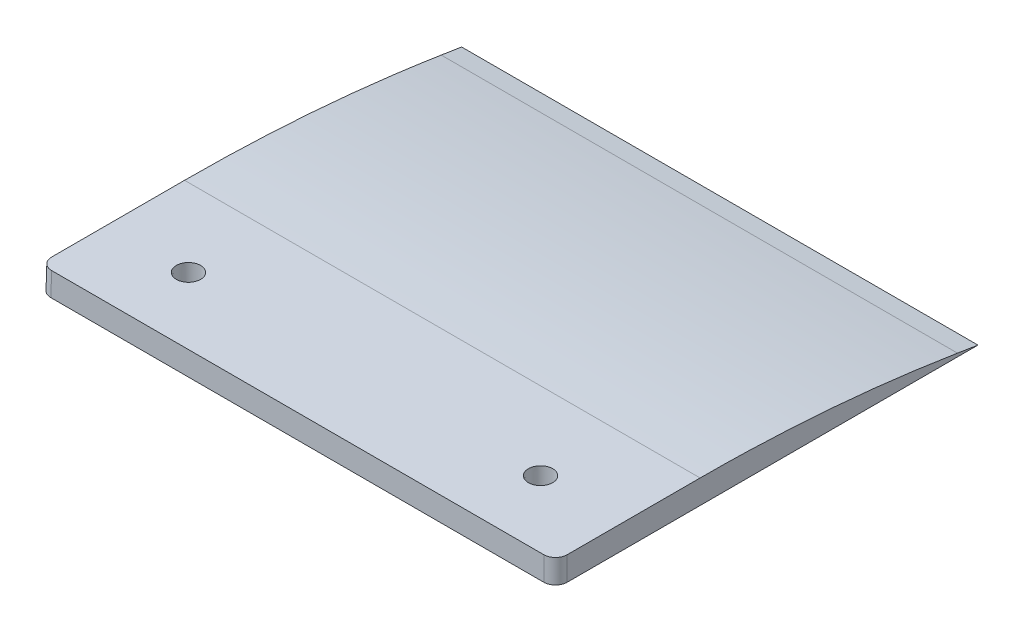
ISO-10303-21;
HEADER;
FILE_DESCRIPTION(('STEP AP214'),'2;1');
FILE_NAME('part.step','',(''),(''),'','','');
FILE_SCHEMA(('AUTOMOTIVE_DESIGN { 1 0 10303 214 1 1 1 1 }'));
ENDSEC;
DATA;
#1=APPLICATION_CONTEXT('core data for automotive mechanical design processes');
#2=APPLICATION_PROTOCOL_DEFINITION('international standard','automotive_design',2000,#1);
#3=PRODUCT_CONTEXT('',#1,'mechanical');
#4=PRODUCT('Part','Part','',(#3));
#5=PRODUCT_RELATED_PRODUCT_CATEGORY('part','',(#4));
#6=PRODUCT_DEFINITION_FORMATION('','',#4);
#7=PRODUCT_DEFINITION_CONTEXT('part definition',#1,'design');
#8=PRODUCT_DEFINITION('design','',#6,#7);
#9=PRODUCT_DEFINITION_SHAPE('','',#8);
#10=(LENGTH_UNIT() NAMED_UNIT(*) SI_UNIT(.MILLI.,.METRE.));
#11=(NAMED_UNIT(*) PLANE_ANGLE_UNIT() SI_UNIT($,.RADIAN.));
#12=(NAMED_UNIT(*) SI_UNIT($,.STERADIAN.) SOLID_ANGLE_UNIT());
#13=UNCERTAINTY_MEASURE_WITH_UNIT(LENGTH_MEASURE(1.E-05),#10,'distance_accuracy_value','');
#14=(GEOMETRIC_REPRESENTATION_CONTEXT(3) GLOBAL_UNCERTAINTY_ASSIGNED_CONTEXT((#13)) GLOBAL_UNIT_ASSIGNED_CONTEXT((#10,
#11,#12)) REPRESENTATION_CONTEXT('',''));
#15=CARTESIAN_POINT('',(0.,0.,0.));
#16=DIRECTION('',(0.,0.,1.));
#17=DIRECTION('',(1.,0.,0.));
#18=AXIS2_PLACEMENT_3D('',#15,#16,#17);
#19=CARTESIAN_POINT('',(0.,10.,0.));
#20=DIRECTION('',(0.,-1.,0.));
#21=DIRECTION('',(0.,0.,-1.));
#22=AXIS2_PLACEMENT_3D('',#19,#20,#21);
#23=PLANE('',#22);
#24=DIRECTION('',(0.,0.,1.));
#25=VECTOR('',#24,1.);
#26=CARTESIAN_POINT('',(109.825449350718,10.,0.));
#27=LINE('',#26,#25);
#28=CARTESIAN_POINT('',(109.825449350718,10.,84.8262108749358));
#29=VERTEX_POINT('',#28);
#30=CARTESIAN_POINT('',(109.825449350718,10.,28.2191203595226));
#31=VERTEX_POINT('',#30);
#32=EDGE_CURVE('E132',#29,#31,#27,.F.);
#33=ORIENTED_EDGE('',*,*,#32,.T.);
#34=DIRECTION('',(-1.,0.,0.));
#35=VECTOR('',#34,1.);
#36=CARTESIAN_POINT('',(-109.825449350718,10.,28.2191203595226));
#37=LINE('',#36,#35);
#38=CARTESIAN_POINT('',(-109.825449350718,10.,28.2191203595226));
#39=VERTEX_POINT('',#38);
#40=EDGE_CURVE('E170',#31,#39,#37,.T.);
#41=ORIENTED_EDGE('',*,*,#40,.T.);
#42=DIRECTION('',(0.,0.,-1.));
#43=VECTOR('',#42,1.);
#44=CARTESIAN_POINT('',(-109.825449350718,10.,0.));
#45=LINE('',#44,#43);
#46=CARTESIAN_POINT('',(-109.825449350718,10.,84.8262108749358));
#47=VERTEX_POINT('',#46);
#48=EDGE_CURVE('E144',#39,#47,#45,.F.);
#49=ORIENTED_EDGE('',*,*,#48,.T.);
#50=CARTESIAN_POINT('',(-104.824687710498,10.,84.8246877104982));
#51=DIRECTION('',(0.,-1.,0.));
#52=DIRECTION('',(-0.707106781186548,0.,0.707106781186548));
#53=AXIS2_PLACEMENT_3D('',#50,#51,#52);
#54=ELLIPSE('',#53,5.00152316445525,5.);
#55=CARTESIAN_POINT('',(-104.826210874936,10.,89.8254493507178));
#56=VERTEX_POINT('',#55);
#57=EDGE_CURVE('E158',#47,#56,#54,.F.);
#58=ORIENTED_EDGE('',*,*,#57,.T.);
#59=DIRECTION('',(-1.,0.,0.));
#60=VECTOR('',#59,1.);
#61=CARTESIAN_POINT('',(0.,10.,89.8254493507178));
#62=LINE('',#61,#60);
#63=CARTESIAN_POINT('',(104.826210874936,10.,89.8254493507178));
#64=VERTEX_POINT('',#63);
#65=EDGE_CURVE('E141',#56,#64,#62,.F.);
#66=ORIENTED_EDGE('',*,*,#65,.T.);
#67=CARTESIAN_POINT('',(104.824687710498,10.,84.8246877104982));
#68=DIRECTION('',(0.,-1.,0.));
#69=DIRECTION('',(0.707106781186548,0.,0.707106781186548));
#70=AXIS2_PLACEMENT_3D('',#67,#68,#69);
#71=ELLIPSE('',#70,5.00152316445525,5.);
#72=EDGE_CURVE('E160',#64,#29,#71,.F.);
#73=ORIENTED_EDGE('',*,*,#72,.T.);
#74=EDGE_LOOP('',(#33,#41,#49,#58,#66,#73));
#75=FACE_BOUND('',#74,.T.);
#76=CARTESIAN_POINT('',(-75.,10.,61.3636363636363));
#77=DIRECTION('',(0.,-1.,0.));
#78=DIRECTION('',(0.,0.,-1.));
#79=AXIS2_PLACEMENT_3D('',#76,#77,#78);
#80=CIRCLE('',#79,5.17455064928218);
#81=CARTESIAN_POINT('',(-75.,10.,56.1890857143541));
#82=VERTEX_POINT('',#81);
#83=EDGE_CURVE('E119',#82,#82,#80,.F.);
#84=ORIENTED_EDGE('',*,*,#83,.F.);
#85=EDGE_LOOP('',(#84));
#86=FACE_BOUND('',#85,.T.);
#87=CARTESIAN_POINT('',(75.,10.,61.3636363636363));
#88=DIRECTION('',(0.,-1.,0.));
#89=DIRECTION('',(0.,0.,-1.));
#90=AXIS2_PLACEMENT_3D('',#87,#88,#89);
#91=CIRCLE('',#90,5.17455064928218);
#92=CARTESIAN_POINT('',(75.,10.,56.1890857143541));
#93=VERTEX_POINT('',#92);
#94=EDGE_CURVE('E136',#93,#93,#91,.F.);
#95=ORIENTED_EDGE('',*,*,#94,.F.);
#96=EDGE_LOOP('',(#95));
#97=FACE_BOUND('',#96,.T.);
#98=ADVANCED_FACE('F35',(#75,#86,#97),#23,.F.);
#99=CARTESIAN_POINT('',(0.,0.,0.));
#100=DIRECTION('',(0.,-1.,0.));
#101=DIRECTION('',(0.,0.,-1.));
#102=AXIS2_PLACEMENT_3D('',#99,#100,#101);
#103=PLANE('',#102);
#104=CARTESIAN_POINT('',(-75.,0.,61.3636363636363));
#105=DIRECTION('',(0.,1.,0.));
#106=DIRECTION('',(0.,0.,1.));
#107=AXIS2_PLACEMENT_3D('',#104,#105,#106);
#108=CIRCLE('',#107,5.00000000000001);
#109=CARTESIAN_POINT('',(-75.,0.,66.3636363636363));
#110=VERTEX_POINT('',#109);
#111=EDGE_CURVE('E135',#110,#110,#108,.T.);
#112=ORIENTED_EDGE('',*,*,#111,.T.);
#113=EDGE_LOOP('',(#112));
#114=FACE_BOUND('',#113,.T.);
#115=DIRECTION('',(0.,0.,-1.));
#116=VECTOR('',#115,1.);
#117=CARTESIAN_POINT('',(110.,0.,90.));
#118=LINE('',#117,#116);
#119=CARTESIAN_POINT('',(110.,0.,85.000761524218));
#120=VERTEX_POINT('',#119);
#121=CARTESIAN_POINT('',(110.,0.,-90.));
#122=VERTEX_POINT('',#121);
#123=EDGE_CURVE('E114',#120,#122,#118,.T.);
#124=ORIENTED_EDGE('',*,*,#123,.F.);
#125=CARTESIAN_POINT('',(104.99923835978,0.,84.9992383597804));
#126=DIRECTION('',(0.,-1.,0.));
#127=DIRECTION('',(0.707106781186548,0.,0.707106781186548));
#128=AXIS2_PLACEMENT_3D('',#125,#126,#127);
#129=ELLIPSE('',#128,5.00152316445525,5.);
#130=CARTESIAN_POINT('',(105.000761524218,0.,90.));
#131=VERTEX_POINT('',#130);
#132=EDGE_CURVE('E151',#120,#131,#129,.T.);
#133=ORIENTED_EDGE('',*,*,#132,.T.);
#134=DIRECTION('',(1.,0.,0.));
#135=VECTOR('',#134,1.);
#136=CARTESIAN_POINT('',(-110.,0.,90.));
#137=LINE('',#136,#135);
#138=CARTESIAN_POINT('',(-105.000761524218,0.,90.));
#139=VERTEX_POINT('',#138);
#140=EDGE_CURVE('E126',#139,#131,#137,.T.);
#141=ORIENTED_EDGE('',*,*,#140,.F.);
#142=CARTESIAN_POINT('',(-104.99923835978,0.,84.9992383597804));
#143=DIRECTION('',(0.,-1.,0.));
#144=DIRECTION('',(-0.707106781186548,0.,0.707106781186548));
#145=AXIS2_PLACEMENT_3D('',#142,#143,#144);
#146=ELLIPSE('',#145,5.00152316445525,5.);
#147=CARTESIAN_POINT('',(-110.,0.,85.000761524218));
#148=VERTEX_POINT('',#147);
#149=EDGE_CURVE('E149',#139,#148,#146,.T.);
#150=ORIENTED_EDGE('',*,*,#149,.T.);
#151=DIRECTION('',(0.,0.,1.));
#152=VECTOR('',#151,1.);
#153=CARTESIAN_POINT('',(-110.,0.,90.));
#154=LINE('',#153,#152);
#155=CARTESIAN_POINT('',(-110.,0.,-90.));
#156=VERTEX_POINT('',#155);
#157=EDGE_CURVE('E124',#156,#148,#154,.T.);
#158=ORIENTED_EDGE('',*,*,#157,.F.);
#159=DIRECTION('',(-1.,0.,0.));
#160=VECTOR('',#159,1.);
#161=CARTESIAN_POINT('',(-110.,0.,-90.));
#162=LINE('',#161,#160);
#163=EDGE_CURVE('E104',#122,#156,#162,.T.);
#164=ORIENTED_EDGE('',*,*,#163,.F.);
#165=EDGE_LOOP('',(#124,#133,#141,#150,#158,#164));
#166=FACE_BOUND('',#165,.T.);
#167=CARTESIAN_POINT('',(75.,0.,61.3636363636363));
#168=DIRECTION('',(0.,1.,0.));
#169=DIRECTION('',(0.,0.,1.));
#170=AXIS2_PLACEMENT_3D('',#167,#168,#169);
#171=CIRCLE('',#170,5.00000000000001);
#172=CARTESIAN_POINT('',(75.,0.,66.3636363636363));
#173=VERTEX_POINT('',#172);
#174=EDGE_CURVE('E138',#173,#173,#171,.T.);
#175=ORIENTED_EDGE('',*,*,#174,.T.);
#176=EDGE_LOOP('',(#175));
#177=FACE_BOUND('',#176,.T.);
#178=ADVANCED_FACE('F121',(#114,#166,#177),#103,.T.);
#179=CARTESIAN_POINT('',(110.,0.,90.));
#180=DIRECTION('',(0.999847695156391,0.0174524064372835,0.));
#181=DIRECTION('',(-0.0174524064372836,0.999847695156391,0.));
#182=AXIS2_PLACEMENT_3D('',#179,#180,#181);
#183=PLANE('',#182);
#184=DIRECTION('',(0.00273056356472123,-0.156433881853228,-0.987684658497311));
#185=VECTOR('',#184,1.);
#186=CARTESIAN_POINT('',(109.824630494652,10.0469122326146,-26.5758822379837));
#187=LINE('',#186,#185);
#188=CARTESIAN_POINT('',(109.999973415091,0.0015230484360744,-89.9999734150907));
#189=VERTEX_POINT('',#188);
#190=CARTESIAN_POINT('',(109.975879920718,1.38183841659633,-81.2850051686397));
#191=VERTEX_POINT('',#190);
#192=EDGE_CURVE('E168',#189,#191,#187,.F.);
#193=ORIENTED_EDGE('',*,*,#192,.T.);
#194=CARTESIAN_POINT('',(122.04399480047,-690.,28.2191203595226));
#195=DIRECTION('',(0.999847695156391,0.0174524064372835,0.));
#196=DIRECTION('',(0.0174524064372836,-0.999847695156391,0.));
#197=AXIS2_PLACEMENT_3D('',#194,#195,#196);
#198=ELLIPSE('',#197,700.106629630735,700.);
#199=EDGE_CURVE('E11',#191,#31,#198,.T.);
#200=ORIENTED_EDGE('',*,*,#199,.T.);
#201=ORIENTED_EDGE('',*,*,#32,.F.);
#202=DIRECTION('',(-0.0174497491606827,0.999695459881887,-0.0174497491606827));
#203=VECTOR('',#202,1.);
#204=CARTESIAN_POINT('',(110.001522236849,-0.0872088907003298,85.0022837610675));
#205=LINE('',#204,#203);
#206=EDGE_CURVE('E109',#29,#120,#205,.F.);
#207=ORIENTED_EDGE('',*,*,#206,.T.);
#208=ORIENTED_EDGE('',*,*,#123,.T.);
#209=DIRECTION('',(0.0174497491606827,-0.999695459881888,-0.0174497491606827));
#210=VECTOR('',#209,1.);
#211=CARTESIAN_POINT('',(109.93301137593,3.8377757026427,-89.9330113759305));
#212=LINE('',#211,#210);
#213=EDGE_CURVE('E99',#189,#122,#212,.T.);
#214=ORIENTED_EDGE('',*,*,#213,.F.);
#215=EDGE_LOOP('',(#193,#200,#201,#207,#208,#214));
#216=FACE_BOUND('',#215,.T.);
#217=ADVANCED_FACE('F115',(#216),#183,.T.);
#218=CARTESIAN_POINT('',(-110.,0.,-90.));
#219=DIRECTION('',(0.,0.0174524064372835,-0.999847695156391));
#220=DIRECTION('',(0.,0.999847695156391,0.0174524064372835));
#221=AXIS2_PLACEMENT_3D('',#218,#219,#220);
#222=PLANE('',#221);
#223=DIRECTION('',(-0.0174497491606827,-0.999695459881888,-0.0174497491606827));
#224=VECTOR('',#223,1.);
#225=CARTESIAN_POINT('',(-109.945191125761,3.13999830216221,-89.9451911257613));
#226=LINE('',#225,#224);
#227=CARTESIAN_POINT('',(-109.999973415091,0.00152304843607483,-89.9999734150907));
#228=VERTEX_POINT('',#227);
#229=EDGE_CURVE('E110',#228,#156,#226,.T.);
#230=ORIENTED_EDGE('',*,*,#229,.F.);
#231=DIRECTION('',(-1.,0.,0.));
#232=VECTOR('',#231,1.);
#233=CARTESIAN_POINT('',(-110.,0.00152304843607533,-89.9999734150907));
#234=LINE('',#233,#232);
#235=EDGE_CURVE('E107',#228,#189,#234,.F.);
#236=ORIENTED_EDGE('',*,*,#235,.T.);
#237=ORIENTED_EDGE('',*,*,#213,.T.);
#238=ORIENTED_EDGE('',*,*,#163,.T.);
#239=EDGE_LOOP('',(#230,#236,#237,#238));
#240=FACE_BOUND('',#239,.T.);
#241=ADVANCED_FACE('F102',(#240),#222,.T.);
#242=CARTESIAN_POINT('',(-110.,0.,90.));
#243=DIRECTION('',(-0.999847695156391,0.0174524064372835,0.));
#244=DIRECTION('',(-0.0174524064372836,-0.999847695156391,0.));
#245=AXIS2_PLACEMENT_3D('',#242,#243,#244);
#246=PLANE('',#245);
#247=ORIENTED_EDGE('',*,*,#48,.F.);
#248=CARTESIAN_POINT('',(-122.04399480047,-690.,28.2191203595226));
#249=DIRECTION('',(-0.999847695156391,0.0174524064372835,0.));
#250=DIRECTION('',(0.0174524064372836,0.999847695156391,0.));
#251=AXIS2_PLACEMENT_3D('',#248,#249,#250);
#252=ELLIPSE('',#251,700.106629630735,700.);
#253=CARTESIAN_POINT('',(-109.975879920718,1.38183841659633,-81.2850051686397));
#254=VERTEX_POINT('',#253);
#255=EDGE_CURVE('E57',#39,#254,#252,.T.);
#256=ORIENTED_EDGE('',*,*,#255,.T.);
#257=DIRECTION('',(0.00273056356472123,0.156433881853228,0.987684658497311));
#258=VECTOR('',#257,1.);
#259=CARTESIAN_POINT('',(-109.824630494652,10.0469122326146,-26.5758822379837));
#260=LINE('',#259,#258);
#261=EDGE_CURVE('E165',#254,#228,#260,.F.);
#262=ORIENTED_EDGE('',*,*,#261,.T.);
#263=ORIENTED_EDGE('',*,*,#229,.T.);
#264=ORIENTED_EDGE('',*,*,#157,.T.);
#265=DIRECTION('',(0.0174497491606827,0.999695459881887,-0.0174497491606827));
#266=VECTOR('',#265,1.);
#267=CARTESIAN_POINT('',(-110.001522236849,-0.0872088907003299,85.0022837610675));
#268=LINE('',#267,#266);
#269=EDGE_CURVE('E162',#148,#47,#268,.T.);
#270=ORIENTED_EDGE('',*,*,#269,.T.);
#271=EDGE_LOOP('',(#247,#256,#262,#263,#264,#270));
#272=FACE_BOUND('',#271,.T.);
#273=ADVANCED_FACE('F178',(#272),#246,.T.);
#274=CARTESIAN_POINT('',(-110.,0.,90.));
#275=DIRECTION('',(0.,0.0174524064372835,0.999847695156391));
#276=DIRECTION('',(0.,-0.999847695156391,0.0174524064372835));
#277=AXIS2_PLACEMENT_3D('',#274,#275,#276);
#278=PLANE('',#277);
#279=ORIENTED_EDGE('',*,*,#140,.T.);
#280=DIRECTION('',(-0.0174497491606827,0.999695459881887,-0.0174497491606827));
#281=VECTOR('',#280,1.);
#282=CARTESIAN_POINT('',(104.935295136998,3.75056681194238,89.9345336127799));
#283=LINE('',#282,#281);
#284=EDGE_CURVE('E156',#131,#64,#283,.T.);
#285=ORIENTED_EDGE('',*,*,#284,.T.);
#286=ORIENTED_EDGE('',*,*,#65,.F.);
#287=DIRECTION('',(0.0174497491606827,0.999695459881887,-0.0174497491606827));
#288=VECTOR('',#287,1.);
#289=CARTESIAN_POINT('',(-105.002283761068,-0.0872088907003298,90.0015222368494));
#290=LINE('',#289,#288);
#291=EDGE_CURVE('E153',#56,#139,#290,.F.);
#292=ORIENTED_EDGE('',*,*,#291,.T.);
#293=EDGE_LOOP('',(#279,#285,#286,#292));
#294=FACE_BOUND('',#293,.T.);
#295=ADVANCED_FACE('F187',(#294),#278,.T.);
#296=CARTESIAN_POINT('',(-75.,0.,61.3636363636363));
#297=DIRECTION('',(0.,1.,0.));
#298=DIRECTION('',(0.,0.,1.));
#299=AXIS2_PLACEMENT_3D('',#296,#297,#298);
#300=CONICAL_SURFACE('',#299,5.00000000000001,0.0174532925199433);
#301=ORIENTED_EDGE('',*,*,#83,.T.);
#302=EDGE_LOOP('',(#301));
#303=FACE_BOUND('',#302,.T.);
#304=ORIENTED_EDGE('',*,*,#111,.F.);
#305=EDGE_LOOP('',(#304));
#306=FACE_BOUND('',#305,.T.);
#307=ADVANCED_FACE('F205',(#303,#306),#300,.F.);
#308=CARTESIAN_POINT('',(75.,0.,61.3636363636363));
#309=DIRECTION('',(0.,1.,0.));
#310=DIRECTION('',(0.,0.,1.));
#311=AXIS2_PLACEMENT_3D('',#308,#309,#310);
#312=CONICAL_SURFACE('',#311,5.00000000000001,0.0174532925199433);
#313=ORIENTED_EDGE('',*,*,#94,.T.);
#314=EDGE_LOOP('',(#313));
#315=FACE_BOUND('',#314,.T.);
#316=ORIENTED_EDGE('',*,*,#174,.F.);
#317=EDGE_LOOP('',(#316));
#318=FACE_BOUND('',#317,.T.);
#319=ADVANCED_FACE('F208',(#315,#318),#312,.F.);
#320=CARTESIAN_POINT('',(105.002283761068,-0.174470922886748,85.0022837610675));
#321=DIRECTION('',(0.0174497491606827,-0.999695459881888,0.0174497491606827));
#322=DIRECTION('',(0.,-0.0174524064372836,-0.999847695156391));
#323=AXIS2_PLACEMENT_3D('',#320,#321,#322);
#324=CYLINDRICAL_SURFACE('',#323,5.);
#325=ORIENTED_EDGE('',*,*,#72,.F.);
#326=ORIENTED_EDGE('',*,*,#284,.F.);
#327=ORIENTED_EDGE('',*,*,#132,.F.);
#328=ORIENTED_EDGE('',*,*,#206,.F.);
#329=EDGE_LOOP('',(#325,#326,#327,#328));
#330=FACE_BOUND('',#329,.T.);
#331=ADVANCED_FACE('F191',(#330),#324,.T.);
#332=CARTESIAN_POINT('',(-105.002283761068,-0.174470922886748,85.0022837610675));
#333=DIRECTION('',(-0.0174497491606827,-0.999695459881888,0.0174497491606827));
#334=DIRECTION('',(0.,-0.0174524064372836,-0.999847695156391));
#335=AXIS2_PLACEMENT_3D('',#332,#333,#334);
#336=CYLINDRICAL_SURFACE('',#335,5.);
#337=ORIENTED_EDGE('',*,*,#57,.F.);
#338=ORIENTED_EDGE('',*,*,#269,.F.);
#339=ORIENTED_EDGE('',*,*,#149,.F.);
#340=ORIENTED_EDGE('',*,*,#291,.F.);
#341=EDGE_LOOP('',(#337,#338,#339,#340));
#342=FACE_BOUND('',#341,.T.);
#343=ADVANCED_FACE('F183',(#342),#336,.T.);
#344=CARTESIAN_POINT('',(0.,10.,-26.8720744177109));
#345=DIRECTION('',(0.,0.987688340595138,-0.156434465040232));
#346=DIRECTION('',(1.,0.,0.));
#347=AXIS2_PLACEMENT_3D('',#344,#345,#346);
#348=PLANE('',#347);
#349=ORIENTED_EDGE('',*,*,#261,.F.);
#350=DIRECTION('',(-1.,0.,0.));
#351=VECTOR('',#350,1.);
#352=CARTESIAN_POINT('',(109.825449350718,1.38183841659645,-81.2850051686397));
#353=LINE('',#352,#351);
#354=EDGE_CURVE('E43',#254,#191,#353,.F.);
#355=ORIENTED_EDGE('',*,*,#354,.T.);
#356=ORIENTED_EDGE('',*,*,#192,.F.);
#357=ORIENTED_EDGE('',*,*,#235,.F.);
#358=EDGE_LOOP('',(#349,#355,#356,#357));
#359=FACE_BOUND('',#358,.T.);
#360=ADVANCED_FACE('F193',(#359),#348,.T.);
#361=CARTESIAN_POINT('',(0.,-690.,28.2191203595226));
#362=DIRECTION('',(1.,0.,0.));
#363=DIRECTION('',(0.,0.,-1.));
#364=AXIS2_PLACEMENT_3D('',#361,#362,#363);
#365=CYLINDRICAL_SURFACE('',#364,700.);
#366=ORIENTED_EDGE('',*,*,#199,.F.);
#367=ORIENTED_EDGE('',*,*,#354,.F.);
#368=ORIENTED_EDGE('',*,*,#255,.F.);
#369=ORIENTED_EDGE('',*,*,#40,.F.);
#370=EDGE_LOOP('',(#366,#367,#368,#369));
#371=FACE_BOUND('',#370,.T.);
#372=ADVANCED_FACE('F37',(#371),#365,.T.);
#373=CLOSED_SHELL('',(#98,#178,#217,#241,#273,#295,#307,#319,#331,#343,#360,#372));
#374=MANIFOLD_SOLID_BREP('B2',#373);
#375=ADVANCED_BREP_SHAPE_REPRESENTATION('',(#18,#374),#14);
#376=SHAPE_DEFINITION_REPRESENTATION(#9,#375);
ENDSEC;
END-ISO-10303-21;
